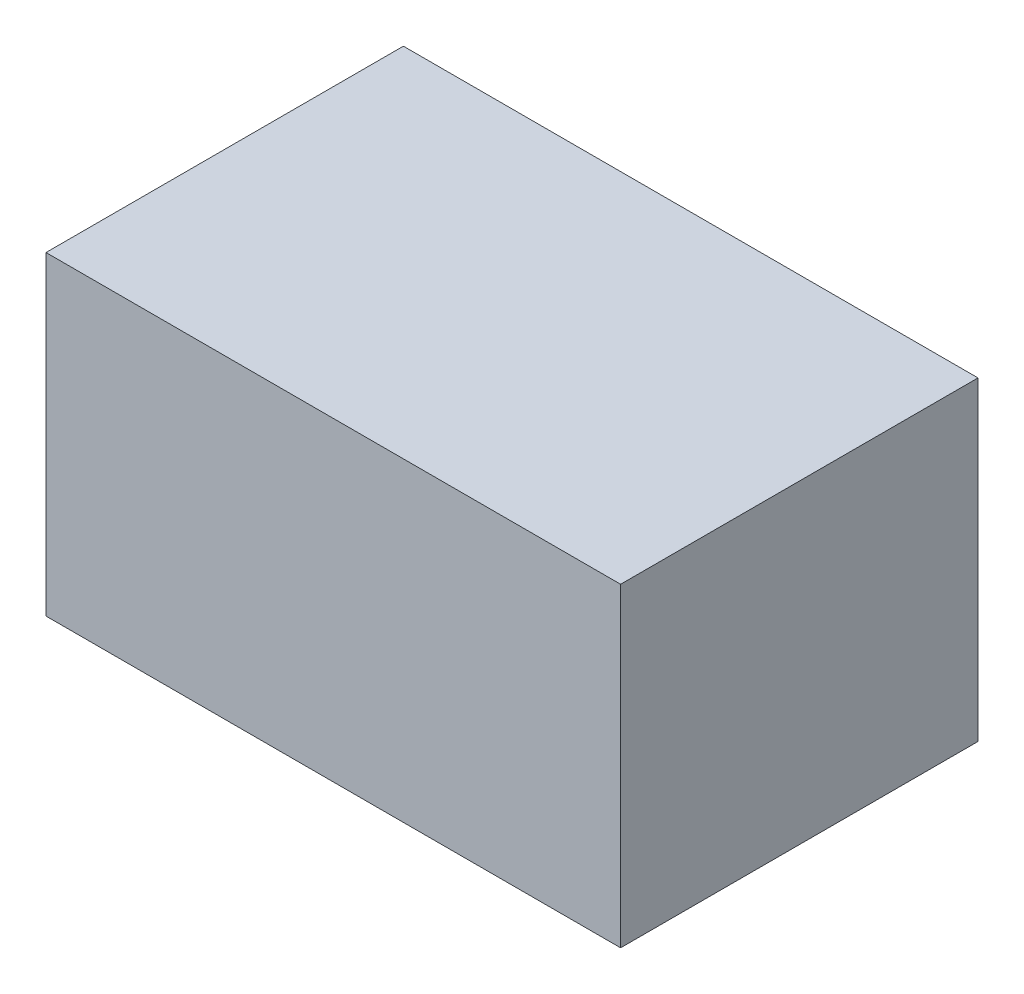
ISO-10303-21;
HEADER;
FILE_DESCRIPTION(('STEP AP214'),'2;1');
FILE_NAME('part.step','',(''),(''),'','','');
FILE_SCHEMA(('AUTOMOTIVE_DESIGN { 1 0 10303 214 1 1 1 1 }'));
ENDSEC;
DATA;
#1=APPLICATION_CONTEXT('core data for automotive mechanical design processes');
#2=APPLICATION_PROTOCOL_DEFINITION('international standard','automotive_design',2000,#1);
#3=PRODUCT_CONTEXT('',#1,'mechanical');
#4=PRODUCT('Part','Part','',(#3));
#5=PRODUCT_RELATED_PRODUCT_CATEGORY('part','',(#4));
#6=PRODUCT_DEFINITION_FORMATION('','',#4);
#7=PRODUCT_DEFINITION_CONTEXT('part definition',#1,'design');
#8=PRODUCT_DEFINITION('design','',#6,#7);
#9=PRODUCT_DEFINITION_SHAPE('','',#8);
#10=(LENGTH_UNIT() NAMED_UNIT(*) SI_UNIT(.MILLI.,.METRE.));
#11=(NAMED_UNIT(*) PLANE_ANGLE_UNIT() SI_UNIT($,.RADIAN.));
#12=(NAMED_UNIT(*) SI_UNIT($,.STERADIAN.) SOLID_ANGLE_UNIT());
#13=UNCERTAINTY_MEASURE_WITH_UNIT(LENGTH_MEASURE(1.E-05),#10,'distance_accuracy_value','');
#14=(GEOMETRIC_REPRESENTATION_CONTEXT(3) GLOBAL_UNCERTAINTY_ASSIGNED_CONTEXT((#13)) GLOBAL_UNIT_ASSIGNED_CONTEXT((#10,
#11,#12)) REPRESENTATION_CONTEXT('',''));
#15=CARTESIAN_POINT('',(0.,0.,0.));
#16=DIRECTION('',(0.,0.,1.));
#17=DIRECTION('',(1.,0.,0.));
#18=AXIS2_PLACEMENT_3D('',#15,#16,#17);
#19=CARTESIAN_POINT('',(-20.0525,15.5175,19.729));
#20=DIRECTION('',(1.,0.,0.));
#21=DIRECTION('',(0.,0.,-1.));
#22=AXIS2_PLACEMENT_3D('',#19,#20,#21);
#23=PLANE('',#22);
#24=DIRECTION('',(0.,-1.,0.));
#25=VECTOR('',#24,1.);
#26=CARTESIAN_POINT('',(-20.0525,15.5175,0.));
#27=LINE('',#26,#25);
#28=CARTESIAN_POINT('',(-20.0525,15.5175,0.));
#29=VERTEX_POINT('',#28);
#30=CARTESIAN_POINT('',(-20.0525,-1.8635,0.));
#31=VERTEX_POINT('',#30);
#32=EDGE_CURVE('E101',#29,#31,#27,.T.);
#33=ORIENTED_EDGE('',*,*,#32,.T.);
#34=DIRECTION('',(0.,0.,-1.));
#35=VECTOR('',#34,1.);
#36=CARTESIAN_POINT('',(-20.0525,-1.8635,19.729));
#37=LINE('',#36,#35);
#38=CARTESIAN_POINT('',(-20.0525,-1.8635,19.729));
#39=VERTEX_POINT('',#38);
#40=EDGE_CURVE('E11',#39,#31,#37,.T.);
#41=ORIENTED_EDGE('',*,*,#40,.F.);
#42=DIRECTION('',(0.,-1.,0.));
#43=VECTOR('',#42,1.);
#44=CARTESIAN_POINT('',(-20.0525,15.5175,19.729));
#45=LINE('',#44,#43);
#46=CARTESIAN_POINT('',(-20.0525,15.5175,19.729));
#47=VERTEX_POINT('',#46);
#48=EDGE_CURVE('E95',#47,#39,#45,.T.);
#49=ORIENTED_EDGE('',*,*,#48,.F.);
#50=DIRECTION('',(0.,0.,-1.));
#51=VECTOR('',#50,1.);
#52=CARTESIAN_POINT('',(-20.0525,15.5175,19.729));
#53=LINE('',#52,#51);
#54=EDGE_CURVE('E99',#47,#29,#53,.T.);
#55=ORIENTED_EDGE('',*,*,#54,.T.);
#56=EDGE_LOOP('',(#33,#41,#49,#55));
#57=FACE_BOUND('',#56,.T.);
#58=ADVANCED_FACE('F41',(#57),#23,.F.);
#59=CARTESIAN_POINT('',(-20.0525,-1.8635,19.729));
#60=DIRECTION('',(0.,1.,0.));
#61=DIRECTION('',(0.,0.,1.));
#62=AXIS2_PLACEMENT_3D('',#59,#60,#61);
#63=PLANE('',#62);
#64=DIRECTION('',(1.,0.,0.));
#65=VECTOR('',#64,1.);
#66=CARTESIAN_POINT('',(-20.0525,-1.8635,0.));
#67=LINE('',#66,#65);
#68=CARTESIAN_POINT('',(11.6665,-1.8635,0.));
#69=VERTEX_POINT('',#68);
#70=EDGE_CURVE('E96',#31,#69,#67,.T.);
#71=ORIENTED_EDGE('',*,*,#70,.T.);
#72=DIRECTION('',(0.,0.,-1.));
#73=VECTOR('',#72,1.);
#74=CARTESIAN_POINT('',(11.6665,-1.8635,19.729));
#75=LINE('',#74,#73);
#76=CARTESIAN_POINT('',(11.6665,-1.8635,19.729));
#77=VERTEX_POINT('',#76);
#78=EDGE_CURVE('E47',#77,#69,#75,.T.);
#79=ORIENTED_EDGE('',*,*,#78,.F.);
#80=DIRECTION('',(1.,0.,0.));
#81=VECTOR('',#80,1.);
#82=CARTESIAN_POINT('',(-20.0525,-1.8635,19.729));
#83=LINE('',#82,#81);
#84=EDGE_CURVE('E90',#39,#77,#83,.T.);
#85=ORIENTED_EDGE('',*,*,#84,.F.);
#86=ORIENTED_EDGE('',*,*,#40,.T.);
#87=EDGE_LOOP('',(#71,#79,#85,#86));
#88=FACE_BOUND('',#87,.T.);
#89=ADVANCED_FACE('F94',(#88),#63,.F.);
#90=CARTESIAN_POINT('',(11.6665,-1.8635,19.729));
#91=DIRECTION('',(-1.,0.,0.));
#92=DIRECTION('',(0.,0.,1.));
#93=AXIS2_PLACEMENT_3D('',#90,#91,#92);
#94=PLANE('',#93);
#95=DIRECTION('',(0.,1.,0.));
#96=VECTOR('',#95,1.);
#97=CARTESIAN_POINT('',(11.6665,-1.8635,0.));
#98=LINE('',#97,#96);
#99=CARTESIAN_POINT('',(11.6665,15.5175,0.));
#100=VERTEX_POINT('',#99);
#101=EDGE_CURVE('E71',#69,#100,#98,.T.);
#102=ORIENTED_EDGE('',*,*,#101,.T.);
#103=DIRECTION('',(0.,0.,-1.));
#104=VECTOR('',#103,1.);
#105=CARTESIAN_POINT('',(11.6665,15.5175,19.729));
#106=LINE('',#105,#104);
#107=CARTESIAN_POINT('',(11.6665,15.5175,19.729));
#108=VERTEX_POINT('',#107);
#109=EDGE_CURVE('E100',#108,#100,#106,.T.);
#110=ORIENTED_EDGE('',*,*,#109,.F.);
#111=DIRECTION('',(0.,1.,0.));
#112=VECTOR('',#111,1.);
#113=CARTESIAN_POINT('',(11.6665,-1.8635,19.729));
#114=LINE('',#113,#112);
#115=EDGE_CURVE('E89',#77,#108,#114,.T.);
#116=ORIENTED_EDGE('',*,*,#115,.F.);
#117=ORIENTED_EDGE('',*,*,#78,.T.);
#118=EDGE_LOOP('',(#102,#110,#116,#117));
#119=FACE_BOUND('',#118,.T.);
#120=ADVANCED_FACE('F97',(#119),#94,.F.);
#121=CARTESIAN_POINT('',(11.6665,15.5175,19.729));
#122=DIRECTION('',(0.,-1.,0.));
#123=DIRECTION('',(0.,0.,-1.));
#124=AXIS2_PLACEMENT_3D('',#121,#122,#123);
#125=PLANE('',#124);
#126=DIRECTION('',(-1.,0.,0.));
#127=VECTOR('',#126,1.);
#128=CARTESIAN_POINT('',(11.6665,15.5175,0.));
#129=LINE('',#128,#127);
#130=EDGE_CURVE('E79',#100,#29,#129,.T.);
#131=ORIENTED_EDGE('',*,*,#130,.T.);
#132=ORIENTED_EDGE('',*,*,#54,.F.);
#133=DIRECTION('',(-1.,0.,0.));
#134=VECTOR('',#133,1.);
#135=CARTESIAN_POINT('',(11.6665,15.5175,19.729));
#136=LINE('',#135,#134);
#137=EDGE_CURVE('E60',#108,#47,#136,.T.);
#138=ORIENTED_EDGE('',*,*,#137,.F.);
#139=ORIENTED_EDGE('',*,*,#109,.T.);
#140=EDGE_LOOP('',(#131,#132,#138,#139));
#141=FACE_BOUND('',#140,.T.);
#142=ADVANCED_FACE('F112',(#141),#125,.F.);
#143=CARTESIAN_POINT('',(0.,0.,19.729));
#144=DIRECTION('',(0.,0.,1.));
#145=DIRECTION('',(1.,0.,0.));
#146=AXIS2_PLACEMENT_3D('',#143,#144,#145);
#147=PLANE('',#146);
#148=ORIENTED_EDGE('',*,*,#48,.T.);
#149=ORIENTED_EDGE('',*,*,#84,.T.);
#150=ORIENTED_EDGE('',*,*,#115,.T.);
#151=ORIENTED_EDGE('',*,*,#137,.T.);
#152=EDGE_LOOP('',(#148,#149,#150,#151));
#153=FACE_BOUND('',#152,.T.);
#154=ADVANCED_FACE('F88',(#153),#147,.T.);
#155=CARTESIAN_POINT('',(0.,0.,0.));
#156=DIRECTION('',(0.,0.,1.));
#157=DIRECTION('',(1.,0.,0.));
#158=AXIS2_PLACEMENT_3D('',#155,#156,#157);
#159=PLANE('',#158);
#160=ORIENTED_EDGE('',*,*,#32,.F.);
#161=ORIENTED_EDGE('',*,*,#130,.F.);
#162=ORIENTED_EDGE('',*,*,#101,.F.);
#163=ORIENTED_EDGE('',*,*,#70,.F.);
#164=EDGE_LOOP('',(#160,#161,#162,#163));
#165=FACE_BOUND('',#164,.T.);
#166=ADVANCED_FACE('F114',(#165),#159,.F.);
#167=CLOSED_SHELL('',(#58,#89,#120,#142,#154,#166));
#168=MANIFOLD_SOLID_BREP('B2',#167);
#169=ADVANCED_BREP_SHAPE_REPRESENTATION('',(#18,#168),#14);
#170=SHAPE_DEFINITION_REPRESENTATION(#9,#169);
ENDSEC;
END-ISO-10303-21;
